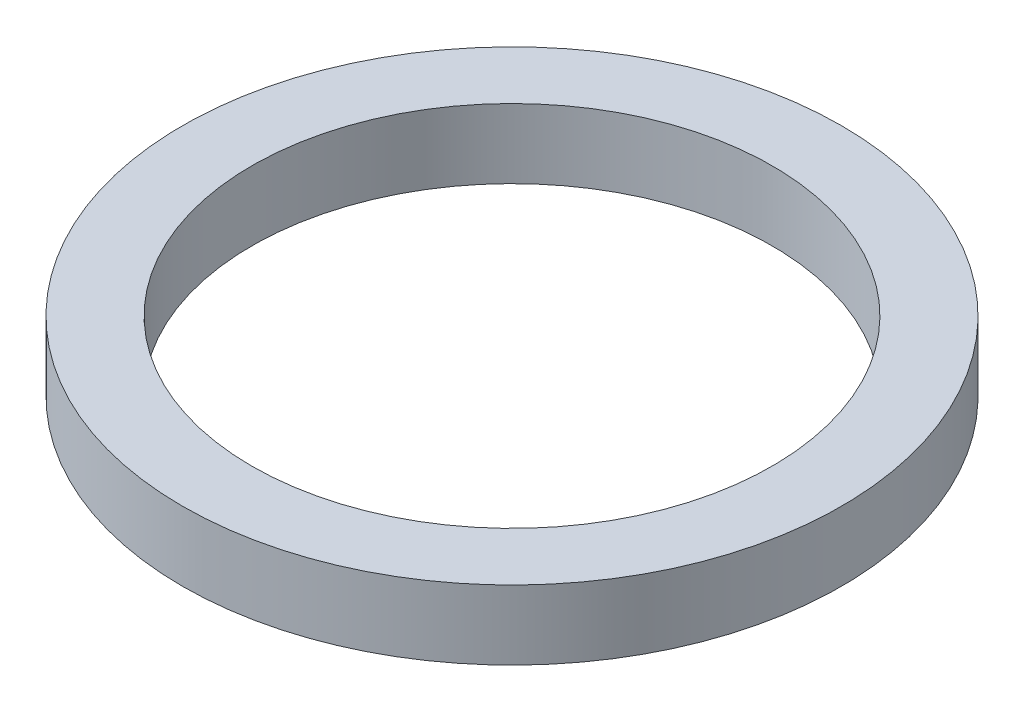
ISO-10303-21;
HEADER;
FILE_DESCRIPTION(('STEP AP214'),'2;1');
FILE_NAME('part.step','',(''),(''),'','','');
FILE_SCHEMA(('AUTOMOTIVE_DESIGN { 1 0 10303 214 1 1 1 1 }'));
ENDSEC;
DATA;
#1=APPLICATION_CONTEXT('core data for automotive mechanical design processes');
#2=APPLICATION_PROTOCOL_DEFINITION('international standard','automotive_design',2000,#1);
#3=PRODUCT_CONTEXT('',#1,'mechanical');
#4=PRODUCT('Part','Part','',(#3));
#5=PRODUCT_RELATED_PRODUCT_CATEGORY('part','',(#4));
#6=PRODUCT_DEFINITION_FORMATION('','',#4);
#7=PRODUCT_DEFINITION_CONTEXT('part definition',#1,'design');
#8=PRODUCT_DEFINITION('design','',#6,#7);
#9=PRODUCT_DEFINITION_SHAPE('','',#8);
#10=(LENGTH_UNIT() NAMED_UNIT(*) SI_UNIT(.MILLI.,.METRE.));
#11=(NAMED_UNIT(*) PLANE_ANGLE_UNIT() SI_UNIT($,.RADIAN.));
#12=(NAMED_UNIT(*) SI_UNIT($,.STERADIAN.) SOLID_ANGLE_UNIT());
#13=UNCERTAINTY_MEASURE_WITH_UNIT(LENGTH_MEASURE(1.E-05),#10,'distance_accuracy_value','');
#14=(GEOMETRIC_REPRESENTATION_CONTEXT(3) GLOBAL_UNCERTAINTY_ASSIGNED_CONTEXT((#13)) GLOBAL_UNIT_ASSIGNED_CONTEXT((#10,
#11,#12)) REPRESENTATION_CONTEXT('',''));
#15=CARTESIAN_POINT('',(0.,0.,0.));
#16=DIRECTION('',(0.,0.,1.));
#17=DIRECTION('',(1.,0.,0.));
#18=AXIS2_PLACEMENT_3D('',#15,#16,#17);
#19=CARTESIAN_POINT('',(0.,2.,0.));
#20=DIRECTION('',(0.,1.,0.));
#21=DIRECTION('',(0.,0.,1.));
#22=AXIS2_PLACEMENT_3D('',#19,#20,#21);
#23=PLANE('',#22);
#24=CARTESIAN_POINT('',(0.,2.,0.));
#25=DIRECTION('',(0.,1.,0.));
#26=DIRECTION('',(0.,0.,1.));
#27=AXIS2_PLACEMENT_3D('',#24,#25,#26);
#28=CIRCLE('',#27,9.5);
#29=CARTESIAN_POINT('',(0.,2.,9.5));
#30=VERTEX_POINT('',#29);
#31=EDGE_CURVE('E10',#30,#30,#28,.T.);
#32=ORIENTED_EDGE('',*,*,#31,.T.);
#33=EDGE_LOOP('',(#32));
#34=FACE_BOUND('',#33,.T.);
#35=CARTESIAN_POINT('',(0.,2.,0.));
#36=DIRECTION('',(0.,1.,0.));
#37=DIRECTION('',(0.,0.,1.));
#38=AXIS2_PLACEMENT_3D('',#35,#36,#37);
#39=CIRCLE('',#38,7.5);
#40=CARTESIAN_POINT('',(0.,2.,7.5));
#41=VERTEX_POINT('',#40);
#42=EDGE_CURVE('E50',#41,#41,#39,.T.);
#43=ORIENTED_EDGE('',*,*,#42,.F.);
#44=EDGE_LOOP('',(#43));
#45=FACE_BOUND('',#44,.T.);
#46=ADVANCED_FACE('F37',(#34,#45),#23,.T.);
#47=CARTESIAN_POINT('',(0.,0.,0.));
#48=DIRECTION('',(0.,1.,0.));
#49=DIRECTION('',(0.,0.,1.));
#50=AXIS2_PLACEMENT_3D('',#47,#48,#49);
#51=PLANE('',#50);
#52=CARTESIAN_POINT('',(0.,0.,0.));
#53=DIRECTION('',(0.,1.,0.));
#54=DIRECTION('',(0.,0.,1.));
#55=AXIS2_PLACEMENT_3D('',#52,#53,#54);
#56=CIRCLE('',#55,9.5);
#57=CARTESIAN_POINT('',(0.,0.,9.5));
#58=VERTEX_POINT('',#57);
#59=EDGE_CURVE('E41',#58,#58,#56,.T.);
#60=ORIENTED_EDGE('',*,*,#59,.F.);
#61=EDGE_LOOP('',(#60));
#62=FACE_BOUND('',#61,.T.);
#63=CARTESIAN_POINT('',(0.,0.,0.));
#64=DIRECTION('',(0.,1.,0.));
#65=DIRECTION('',(0.,0.,1.));
#66=AXIS2_PLACEMENT_3D('',#63,#64,#65);
#67=CIRCLE('',#66,7.5);
#68=CARTESIAN_POINT('',(0.,0.,7.5));
#69=VERTEX_POINT('',#68);
#70=EDGE_CURVE('E52',#69,#69,#67,.T.);
#71=ORIENTED_EDGE('',*,*,#70,.T.);
#72=EDGE_LOOP('',(#71));
#73=FACE_BOUND('',#72,.T.);
#74=ADVANCED_FACE('F64',(#62,#73),#51,.F.);
#75=CARTESIAN_POINT('',(0.,2.,0.));
#76=DIRECTION('',(0.,-1.,0.));
#77=DIRECTION('',(0.,0.,-1.));
#78=AXIS2_PLACEMENT_3D('',#75,#76,#77);
#79=CYLINDRICAL_SURFACE('',#78,9.5);
#80=ORIENTED_EDGE('',*,*,#31,.F.);
#81=EDGE_LOOP('',(#80));
#82=FACE_BOUND('',#81,.T.);
#83=ORIENTED_EDGE('',*,*,#59,.T.);
#84=EDGE_LOOP('',(#83));
#85=FACE_BOUND('',#84,.T.);
#86=ADVANCED_FACE('F39',(#82,#85),#79,.T.);
#87=CARTESIAN_POINT('',(0.,2.,0.));
#88=DIRECTION('',(0.,-1.,0.));
#89=DIRECTION('',(0.,0.,-1.));
#90=AXIS2_PLACEMENT_3D('',#87,#88,#89);
#91=CYLINDRICAL_SURFACE('',#90,7.5);
#92=ORIENTED_EDGE('',*,*,#42,.T.);
#93=EDGE_LOOP('',(#92));
#94=FACE_BOUND('',#93,.T.);
#95=ORIENTED_EDGE('',*,*,#70,.F.);
#96=EDGE_LOOP('',(#95));
#97=FACE_BOUND('',#96,.T.);
#98=ADVANCED_FACE('F60',(#94,#97),#91,.F.);
#99=CLOSED_SHELL('',(#46,#74,#86,#98));
#100=MANIFOLD_SOLID_BREP('B2',#99);
#101=ADVANCED_BREP_SHAPE_REPRESENTATION('',(#18,#100),#14);
#102=SHAPE_DEFINITION_REPRESENTATION(#9,#101);
ENDSEC;
END-ISO-10303-21;
